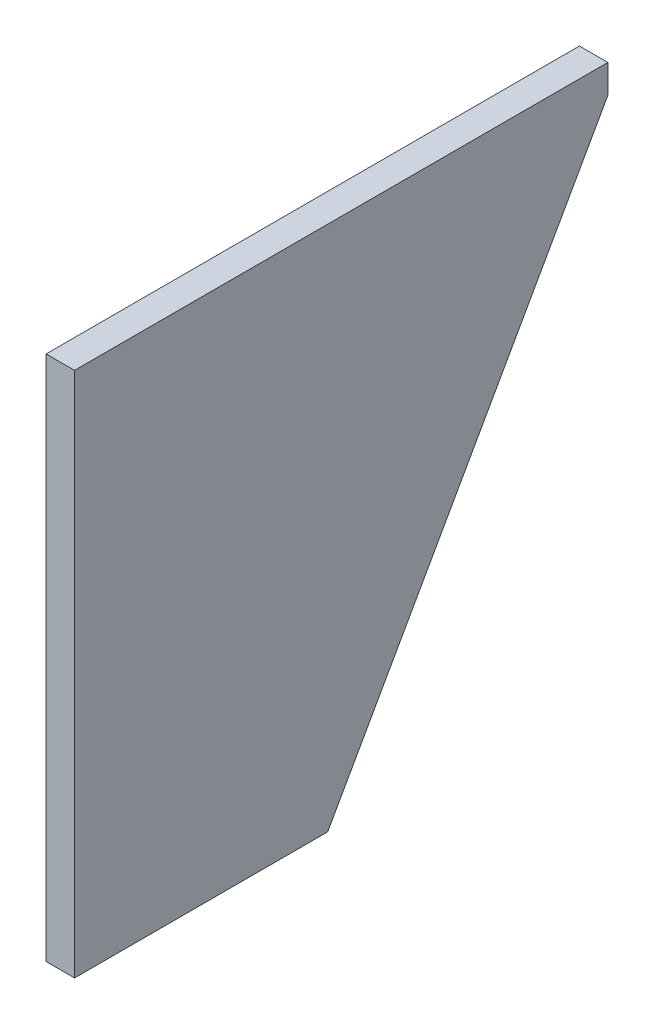
ISO-10303-21;
HEADER;
FILE_DESCRIPTION(('STEP AP214'),'2;1');
FILE_NAME('part.step','',(''),(''),'','','');
FILE_SCHEMA(('AUTOMOTIVE_DESIGN { 1 0 10303 214 1 1 1 1 }'));
ENDSEC;
DATA;
#1=APPLICATION_CONTEXT('core data for automotive mechanical design processes');
#2=APPLICATION_PROTOCOL_DEFINITION('international standard','automotive_design',2000,#1);
#3=PRODUCT_CONTEXT('',#1,'mechanical');
#4=PRODUCT('Part','Part','',(#3));
#5=PRODUCT_RELATED_PRODUCT_CATEGORY('part','',(#4));
#6=PRODUCT_DEFINITION_FORMATION('','',#4);
#7=PRODUCT_DEFINITION_CONTEXT('part definition',#1,'design');
#8=PRODUCT_DEFINITION('design','',#6,#7);
#9=PRODUCT_DEFINITION_SHAPE('','',#8);
#10=(LENGTH_UNIT() NAMED_UNIT(*) SI_UNIT(.MILLI.,.METRE.));
#11=(NAMED_UNIT(*) PLANE_ANGLE_UNIT() SI_UNIT($,.RADIAN.));
#12=(NAMED_UNIT(*) SI_UNIT($,.STERADIAN.) SOLID_ANGLE_UNIT());
#13=UNCERTAINTY_MEASURE_WITH_UNIT(LENGTH_MEASURE(1.E-05),#10,'distance_accuracy_value','');
#14=(GEOMETRIC_REPRESENTATION_CONTEXT(3) GLOBAL_UNCERTAINTY_ASSIGNED_CONTEXT((#13)) GLOBAL_UNIT_ASSIGNED_CONTEXT((#10,
#11,#12)) REPRESENTATION_CONTEXT('',''));
#15=CARTESIAN_POINT('',(0.,0.,0.));
#16=DIRECTION('',(0.,0.,1.));
#17=DIRECTION('',(1.,0.,0.));
#18=AXIS2_PLACEMENT_3D('',#15,#16,#17);
#19=CARTESIAN_POINT('',(-172.754092983453,202.834413861943,-14.9999999999997));
#20=DIRECTION('',(0.,1.,0.));
#21=DIRECTION('',(0.,0.,1.));
#22=AXIS2_PLACEMENT_3D('',#19,#20,#21);
#23=PLANE('',#22);
#24=DIRECTION('',(0.,0.,-1.));
#25=VECTOR('',#24,1.);
#26=CARTESIAN_POINT('',(-192.754092983453,202.834413861943,-14.9999999999997));
#27=LINE('',#26,#25);
#28=CARTESIAN_POINT('',(-192.754092983453,202.834413861943,360.));
#29=VERTEX_POINT('',#28);
#30=CARTESIAN_POINT('',(-192.754092983453,202.834413861943,-14.9999999999997));
#31=VERTEX_POINT('',#30);
#32=EDGE_CURVE('E110',#29,#31,#27,.T.);
#33=ORIENTED_EDGE('',*,*,#32,.F.);
#34=DIRECTION('',(-1.,0.,0.));
#35=VECTOR('',#34,1.);
#36=CARTESIAN_POINT('',(-172.754092983453,202.834413861943,360.));
#37=LINE('',#36,#35);
#38=CARTESIAN_POINT('',(-172.754092983453,202.834413861943,360.));
#39=VERTEX_POINT('',#38);
#40=EDGE_CURVE('E11',#39,#29,#37,.T.);
#41=ORIENTED_EDGE('',*,*,#40,.F.);
#42=DIRECTION('',(0.,0.,-1.));
#43=VECTOR('',#42,1.);
#44=CARTESIAN_POINT('',(-172.754092983453,202.834413861943,-14.9999999999997));
#45=LINE('',#44,#43);
#46=CARTESIAN_POINT('',(-172.754092983453,202.834413861943,-14.9999999999997));
#47=VERTEX_POINT('',#46);
#48=EDGE_CURVE('E105',#39,#47,#45,.T.);
#49=ORIENTED_EDGE('',*,*,#48,.T.);
#50=DIRECTION('',(-1.,0.,0.));
#51=VECTOR('',#50,1.);
#52=CARTESIAN_POINT('',(-172.754092983453,202.834413861943,-14.9999999999997));
#53=LINE('',#52,#51);
#54=EDGE_CURVE('E36',#47,#31,#53,.T.);
#55=ORIENTED_EDGE('',*,*,#54,.T.);
#56=EDGE_LOOP('',(#33,#41,#49,#55));
#57=FACE_BOUND('',#56,.T.);
#58=ADVANCED_FACE('F33',(#57),#23,.T.);
#59=CARTESIAN_POINT('',(-172.754092983453,202.834413861943,360.));
#60=DIRECTION('',(0.,0.,1.));
#61=DIRECTION('',(1.,0.,0.));
#62=AXIS2_PLACEMENT_3D('',#59,#60,#61);
#63=PLANE('',#62);
#64=DIRECTION('',(0.,1.,0.));
#65=VECTOR('',#64,1.);
#66=CARTESIAN_POINT('',(-192.754092983453,202.834413861943,360.));
#67=LINE('',#66,#65);
#68=CARTESIAN_POINT('',(-192.754092983453,-167.165586138057,360.));
#69=VERTEX_POINT('',#68);
#70=EDGE_CURVE('E119',#69,#29,#67,.T.);
#71=ORIENTED_EDGE('',*,*,#70,.F.);
#72=DIRECTION('',(-1.,0.,0.));
#73=VECTOR('',#72,1.);
#74=CARTESIAN_POINT('',(-172.754092983453,-167.165586138057,360.));
#75=LINE('',#74,#73);
#76=CARTESIAN_POINT('',(-172.754092983453,-167.165586138057,360.));
#77=VERTEX_POINT('',#76);
#78=EDGE_CURVE('E42',#77,#69,#75,.T.);
#79=ORIENTED_EDGE('',*,*,#78,.F.);
#80=DIRECTION('',(0.,1.,0.));
#81=VECTOR('',#80,1.);
#82=CARTESIAN_POINT('',(-172.754092983453,202.834413861943,360.));
#83=LINE('',#82,#81);
#84=EDGE_CURVE('E100',#77,#39,#83,.T.);
#85=ORIENTED_EDGE('',*,*,#84,.T.);
#86=ORIENTED_EDGE('',*,*,#40,.T.);
#87=EDGE_LOOP('',(#71,#79,#85,#86));
#88=FACE_BOUND('',#87,.T.);
#89=ADVANCED_FACE('F125',(#88),#63,.T.);
#90=CARTESIAN_POINT('',(-172.754092983453,-167.165586138057,360.));
#91=DIRECTION('',(0.,-1.,0.));
#92=DIRECTION('',(0.,0.,-1.));
#93=AXIS2_PLACEMENT_3D('',#90,#91,#92);
#94=PLANE('',#93);
#95=DIRECTION('',(0.,0.,1.));
#96=VECTOR('',#95,1.);
#97=CARTESIAN_POINT('',(-192.754092983453,-167.165586138057,360.));
#98=LINE('',#97,#96);
#99=CARTESIAN_POINT('',(-192.754092983453,-167.165586138057,182.));
#100=VERTEX_POINT('',#99);
#101=EDGE_CURVE('E89',#100,#69,#98,.T.);
#102=ORIENTED_EDGE('',*,*,#101,.F.);
#103=DIRECTION('',(-1.,0.,0.));
#104=VECTOR('',#103,1.);
#105=CARTESIAN_POINT('',(-172.754092983453,-167.165586138057,182.));
#106=LINE('',#105,#104);
#107=CARTESIAN_POINT('',(-172.754092983453,-167.165586138057,182.));
#108=VERTEX_POINT('',#107);
#109=EDGE_CURVE('E84',#108,#100,#106,.T.);
#110=ORIENTED_EDGE('',*,*,#109,.F.);
#111=DIRECTION('',(0.,0.,1.));
#112=VECTOR('',#111,1.);
#113=CARTESIAN_POINT('',(-172.754092983453,-167.165586138057,360.));
#114=LINE('',#113,#112);
#115=EDGE_CURVE('E87',#108,#77,#114,.T.);
#116=ORIENTED_EDGE('',*,*,#115,.T.);
#117=ORIENTED_EDGE('',*,*,#78,.T.);
#118=EDGE_LOOP('',(#102,#110,#116,#117));
#119=FACE_BOUND('',#118,.T.);
#120=ADVANCED_FACE('F86',(#119),#94,.T.);
#121=CARTESIAN_POINT('',(-172.754092983453,-167.165586138057,182.));
#122=DIRECTION('',(0.,-0.490497645169228,-0.87144251679812));
#123=DIRECTION('',(0.,0.87144251679812,-0.490497645169228));
#124=AXIS2_PLACEMENT_3D('',#121,#122,#123);
#125=PLANE('',#124);
#126=DIRECTION('',(0.,-0.87144251679812,0.490497645169228));
#127=VECTOR('',#126,1.);
#128=CARTESIAN_POINT('',(-192.754092983453,-167.165586138057,182.));
#129=LINE('',#128,#127);
#130=CARTESIAN_POINT('',(-192.754092983453,182.834413861943,-14.9999999999997));
#131=VERTEX_POINT('',#130);
#132=EDGE_CURVE('E116',#131,#100,#129,.T.);
#133=ORIENTED_EDGE('',*,*,#132,.F.);
#134=DIRECTION('',(-1.,0.,0.));
#135=VECTOR('',#134,1.);
#136=CARTESIAN_POINT('',(-172.754092983453,182.834413861943,-14.9999999999997));
#137=LINE('',#136,#135);
#138=CARTESIAN_POINT('',(-172.754092983453,182.834413861943,-14.9999999999997));
#139=VERTEX_POINT('',#138);
#140=EDGE_CURVE('E94',#139,#131,#137,.T.);
#141=ORIENTED_EDGE('',*,*,#140,.F.);
#142=DIRECTION('',(0.,-0.87144251679812,0.490497645169228));
#143=VECTOR('',#142,1.);
#144=CARTESIAN_POINT('',(-172.754092983453,-167.165586138057,182.));
#145=LINE('',#144,#143);
#146=EDGE_CURVE('E99',#139,#108,#145,.T.);
#147=ORIENTED_EDGE('',*,*,#146,.T.);
#148=ORIENTED_EDGE('',*,*,#109,.T.);
#149=EDGE_LOOP('',(#133,#141,#147,#148));
#150=FACE_BOUND('',#149,.T.);
#151=ADVANCED_FACE('F102',(#150),#125,.T.);
#152=CARTESIAN_POINT('',(-172.754092983453,182.834413861943,-14.9999999999997));
#153=DIRECTION('',(0.,0.,-1.));
#154=DIRECTION('',(-1.,0.,0.));
#155=AXIS2_PLACEMENT_3D('',#152,#153,#154);
#156=PLANE('',#155);
#157=DIRECTION('',(0.,-1.,0.));
#158=VECTOR('',#157,1.);
#159=CARTESIAN_POINT('',(-192.754092983453,182.834413861943,-14.9999999999997));
#160=LINE('',#159,#158);
#161=EDGE_CURVE('E113',#31,#131,#160,.T.);
#162=ORIENTED_EDGE('',*,*,#161,.F.);
#163=ORIENTED_EDGE('',*,*,#54,.F.);
#164=DIRECTION('',(0.,-1.,0.));
#165=VECTOR('',#164,1.);
#166=CARTESIAN_POINT('',(-172.754092983453,182.834413861943,-14.9999999999997));
#167=LINE('',#166,#165);
#168=EDGE_CURVE('E103',#47,#139,#167,.T.);
#169=ORIENTED_EDGE('',*,*,#168,.T.);
#170=ORIENTED_EDGE('',*,*,#140,.T.);
#171=EDGE_LOOP('',(#162,#163,#169,#170));
#172=FACE_BOUND('',#171,.T.);
#173=ADVANCED_FACE('F122',(#172),#156,.T.);
#174=CARTESIAN_POINT('',(-172.754092983453,0.,0.));
#175=DIRECTION('',(1.,0.,0.));
#176=DIRECTION('',(0.,0.,-1.));
#177=AXIS2_PLACEMENT_3D('',#174,#175,#176);
#178=PLANE('',#177);
#179=ORIENTED_EDGE('',*,*,#48,.F.);
#180=ORIENTED_EDGE('',*,*,#84,.F.);
#181=ORIENTED_EDGE('',*,*,#115,.F.);
#182=ORIENTED_EDGE('',*,*,#146,.F.);
#183=ORIENTED_EDGE('',*,*,#168,.F.);
#184=EDGE_LOOP('',(#179,#180,#181,#182,#183));
#185=FACE_BOUND('',#184,.T.);
#186=ADVANCED_FACE('F98',(#185),#178,.T.);
#187=CARTESIAN_POINT('',(-192.754092983453,0.,0.));
#188=DIRECTION('',(1.,0.,0.));
#189=DIRECTION('',(0.,0.,-1.));
#190=AXIS2_PLACEMENT_3D('',#187,#188,#189);
#191=PLANE('',#190);
#192=ORIENTED_EDGE('',*,*,#32,.T.);
#193=ORIENTED_EDGE('',*,*,#161,.T.);
#194=ORIENTED_EDGE('',*,*,#132,.T.);
#195=ORIENTED_EDGE('',*,*,#101,.T.);
#196=ORIENTED_EDGE('',*,*,#70,.T.);
#197=EDGE_LOOP('',(#192,#193,#194,#195,#196));
#198=FACE_BOUND('',#197,.T.);
#199=ADVANCED_FACE('F124',(#198),#191,.F.);
#200=CLOSED_SHELL('',(#58,#89,#120,#151,#173,#186,#199));
#201=MANIFOLD_SOLID_BREP('B2',#200);
#202=ADVANCED_BREP_SHAPE_REPRESENTATION('',(#18,#201),#14);
#203=SHAPE_DEFINITION_REPRESENTATION(#9,#202);
ENDSEC;
END-ISO-10303-21;
